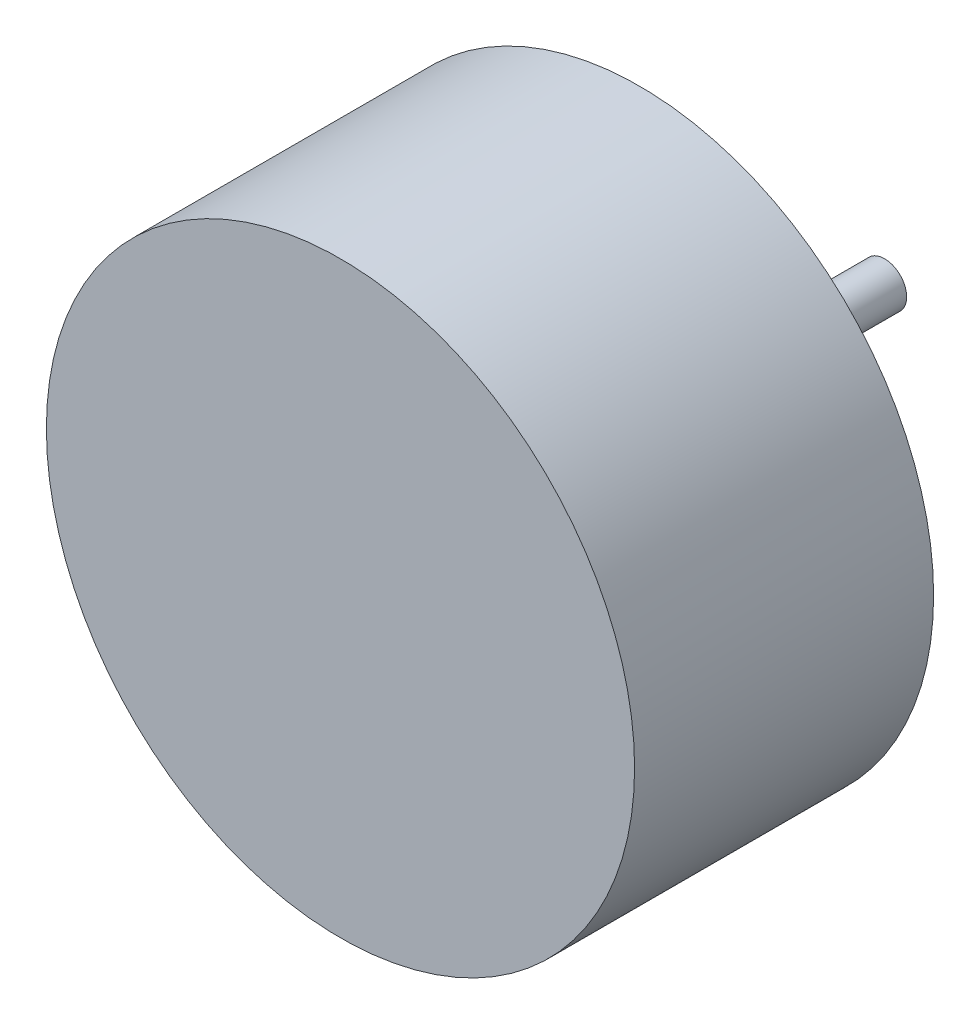
ISO-10303-21;
HEADER;
FILE_DESCRIPTION(('STEP AP214'),'2;1');
FILE_NAME('part.step','',(''),(''),'','','');
FILE_SCHEMA(('AUTOMOTIVE_DESIGN { 1 0 10303 214 1 1 1 1 }'));
ENDSEC;
DATA;
#1=APPLICATION_CONTEXT('core data for automotive mechanical design processes');
#2=APPLICATION_PROTOCOL_DEFINITION('international standard','automotive_design',2000,#1);
#3=PRODUCT_CONTEXT('',#1,'mechanical');
#4=PRODUCT('Part','Part','',(#3));
#5=PRODUCT_RELATED_PRODUCT_CATEGORY('part','',(#4));
#6=PRODUCT_DEFINITION_FORMATION('','',#4);
#7=PRODUCT_DEFINITION_CONTEXT('part definition',#1,'design');
#8=PRODUCT_DEFINITION('design','',#6,#7);
#9=PRODUCT_DEFINITION_SHAPE('','',#8);
#10=(LENGTH_UNIT() NAMED_UNIT(*) SI_UNIT(.MILLI.,.METRE.));
#11=(NAMED_UNIT(*) PLANE_ANGLE_UNIT() SI_UNIT($,.RADIAN.));
#12=(NAMED_UNIT(*) SI_UNIT($,.STERADIAN.) SOLID_ANGLE_UNIT());
#13=UNCERTAINTY_MEASURE_WITH_UNIT(LENGTH_MEASURE(1.E-05),#10,'distance_accuracy_value','');
#14=(GEOMETRIC_REPRESENTATION_CONTEXT(3) GLOBAL_UNCERTAINTY_ASSIGNED_CONTEXT((#13)) GLOBAL_UNIT_ASSIGNED_CONTEXT((#10,
#11,#12)) REPRESENTATION_CONTEXT('',''));
#15=CARTESIAN_POINT('',(0.,0.,0.));
#16=DIRECTION('',(0.,0.,1.));
#17=DIRECTION('',(1.,0.,0.));
#18=AXIS2_PLACEMENT_3D('',#15,#16,#17);
#19=CARTESIAN_POINT('',(0.,0.,12.2));
#20=DIRECTION('',(0.,0.,-1.));
#21=DIRECTION('',(-1.,0.,0.));
#22=AXIS2_PLACEMENT_3D('',#19,#20,#21);
#23=CYLINDRICAL_SURFACE('',#22,12.);
#24=CARTESIAN_POINT('',(0.,0.,12.2));
#25=DIRECTION('',(0.,0.,1.));
#26=DIRECTION('',(1.,0.,0.));
#27=AXIS2_PLACEMENT_3D('',#24,#25,#26);
#28=CIRCLE('',#27,12.);
#29=CARTESIAN_POINT('',(12.,0.,12.2));
#30=VERTEX_POINT('',#29);
#31=EDGE_CURVE('E41',#30,#30,#28,.T.);
#32=ORIENTED_EDGE('',*,*,#31,.F.);
#33=EDGE_LOOP('',(#32));
#34=FACE_BOUND('',#33,.T.);
#35=CARTESIAN_POINT('',(0.,0.,0.));
#36=DIRECTION('',(0.,0.,1.));
#37=DIRECTION('',(1.,0.,0.));
#38=AXIS2_PLACEMENT_3D('',#35,#36,#37);
#39=CIRCLE('',#38,12.);
#40=CARTESIAN_POINT('',(12.,0.,0.));
#41=VERTEX_POINT('',#40);
#42=EDGE_CURVE('E45',#41,#41,#39,.T.);
#43=ORIENTED_EDGE('',*,*,#42,.T.);
#44=EDGE_LOOP('',(#43));
#45=FACE_BOUND('',#44,.T.);
#46=ADVANCED_FACE('F35',(#34,#45),#23,.T.);
#47=CARTESIAN_POINT('',(0.,0.,12.2));
#48=DIRECTION('',(0.,0.,1.));
#49=DIRECTION('',(1.,0.,0.));
#50=AXIS2_PLACEMENT_3D('',#47,#48,#49);
#51=PLANE('',#50);
#52=ORIENTED_EDGE('',*,*,#31,.T.);
#53=EDGE_LOOP('',(#52));
#54=FACE_BOUND('',#53,.T.);
#55=ADVANCED_FACE('F66',(#54),#51,.T.);
#56=CARTESIAN_POINT('',(0.,0.,0.));
#57=DIRECTION('',(0.,0.,1.));
#58=DIRECTION('',(1.,0.,0.));
#59=AXIS2_PLACEMENT_3D('',#56,#57,#58);
#60=PLANE('',#59);
#61=CARTESIAN_POINT('',(0.,0.,0.));
#62=DIRECTION('',(0.,0.,1.));
#63=DIRECTION('',(1.,0.,0.));
#64=AXIS2_PLACEMENT_3D('',#61,#62,#63);
#65=CIRCLE('',#64,0.9);
#66=CARTESIAN_POINT('',(0.9,0.,0.));
#67=VERTEX_POINT('',#66);
#68=EDGE_CURVE('E10',#67,#67,#65,.F.);
#69=ORIENTED_EDGE('',*,*,#68,.F.);
#70=EDGE_LOOP('',(#69));
#71=FACE_BOUND('',#70,.T.);
#72=ORIENTED_EDGE('',*,*,#42,.F.);
#73=EDGE_LOOP('',(#72));
#74=FACE_BOUND('',#73,.T.);
#75=ADVANCED_FACE('F59',(#71,#74),#60,.F.);
#76=CARTESIAN_POINT('',(0.,0.,-10.));
#77=DIRECTION('',(0.,0.,1.));
#78=DIRECTION('',(1.,0.,0.));
#79=AXIS2_PLACEMENT_3D('',#76,#77,#78);
#80=CYLINDRICAL_SURFACE('',#79,0.9);
#81=CARTESIAN_POINT('',(0.,0.,-10.));
#82=DIRECTION('',(0.,0.,-1.));
#83=DIRECTION('',(-1.,0.,0.));
#84=AXIS2_PLACEMENT_3D('',#81,#82,#83);
#85=CIRCLE('',#84,0.9);
#86=CARTESIAN_POINT('',(-0.9,0.,-10.));
#87=VERTEX_POINT('',#86);
#88=EDGE_CURVE('E50',#87,#87,#85,.T.);
#89=ORIENTED_EDGE('',*,*,#88,.F.);
#90=EDGE_LOOP('',(#89));
#91=FACE_BOUND('',#90,.T.);
#92=ORIENTED_EDGE('',*,*,#68,.T.);
#93=EDGE_LOOP('',(#92));
#94=FACE_BOUND('',#93,.T.);
#95=ADVANCED_FACE('F57',(#91,#94),#80,.T.);
#96=CARTESIAN_POINT('',(0.,0.,-10.));
#97=DIRECTION('',(0.,0.,-1.));
#98=DIRECTION('',(-1.,0.,0.));
#99=AXIS2_PLACEMENT_3D('',#96,#97,#98);
#100=PLANE('',#99);
#101=ORIENTED_EDGE('',*,*,#88,.T.);
#102=EDGE_LOOP('',(#101));
#103=FACE_BOUND('',#102,.T.);
#104=ADVANCED_FACE('F55',(#103),#100,.T.);
#105=CLOSED_SHELL('',(#46,#55,#75,#95,#104));
#106=MANIFOLD_SOLID_BREP('B2',#105);
#107=ADVANCED_BREP_SHAPE_REPRESENTATION('',(#18,#106),#14);
#108=SHAPE_DEFINITION_REPRESENTATION(#9,#107);
ENDSEC;
END-ISO-10303-21;
